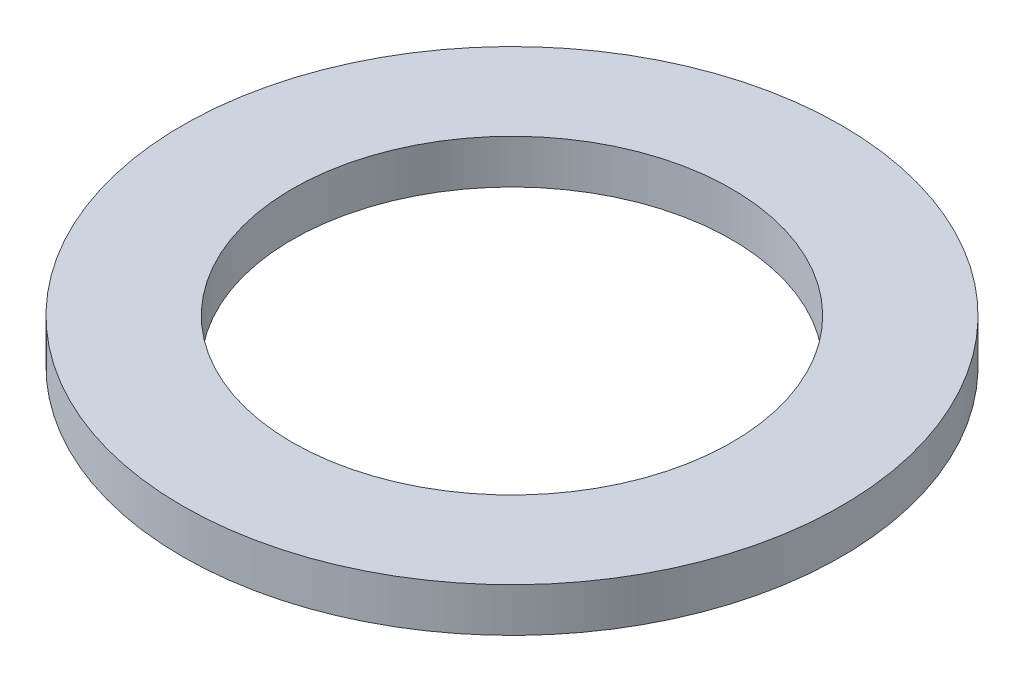
ISO-10303-21;
HEADER;
FILE_DESCRIPTION(('STEP AP214'),'2;1');
FILE_NAME('part.step','',(''),(''),'','','');
FILE_SCHEMA(('AUTOMOTIVE_DESIGN { 1 0 10303 214 1 1 1 1 }'));
ENDSEC;
DATA;
#1=APPLICATION_CONTEXT('core data for automotive mechanical design processes');
#2=APPLICATION_PROTOCOL_DEFINITION('international standard','automotive_design',2000,#1);
#3=PRODUCT_CONTEXT('',#1,'mechanical');
#4=PRODUCT('Part','Part','',(#3));
#5=PRODUCT_RELATED_PRODUCT_CATEGORY('part','',(#4));
#6=PRODUCT_DEFINITION_FORMATION('','',#4);
#7=PRODUCT_DEFINITION_CONTEXT('part definition',#1,'design');
#8=PRODUCT_DEFINITION('design','',#6,#7);
#9=PRODUCT_DEFINITION_SHAPE('','',#8);
#10=(LENGTH_UNIT() NAMED_UNIT(*) SI_UNIT(.MILLI.,.METRE.));
#11=(NAMED_UNIT(*) PLANE_ANGLE_UNIT() SI_UNIT($,.RADIAN.));
#12=(NAMED_UNIT(*) SI_UNIT($,.STERADIAN.) SOLID_ANGLE_UNIT());
#13=UNCERTAINTY_MEASURE_WITH_UNIT(LENGTH_MEASURE(1.E-05),#10,'distance_accuracy_value','');
#14=(GEOMETRIC_REPRESENTATION_CONTEXT(3) GLOBAL_UNCERTAINTY_ASSIGNED_CONTEXT((#13)) GLOBAL_UNIT_ASSIGNED_CONTEXT((#10,
#11,#12)) REPRESENTATION_CONTEXT('',''));
#15=CARTESIAN_POINT('',(0.,0.,0.));
#16=DIRECTION('',(0.,0.,1.));
#17=DIRECTION('',(1.,0.,0.));
#18=AXIS2_PLACEMENT_3D('',#15,#16,#17);
#19=CARTESIAN_POINT('',(0.,1.,0.));
#20=DIRECTION('',(0.,1.,0.));
#21=DIRECTION('',(0.,0.,1.));
#22=AXIS2_PLACEMENT_3D('',#19,#20,#21);
#23=PLANE('',#22);
#24=CARTESIAN_POINT('',(0.,1.,0.));
#25=DIRECTION('',(0.,1.,0.));
#26=DIRECTION('',(0.,0.,1.));
#27=AXIS2_PLACEMENT_3D('',#24,#25,#26);
#28=CIRCLE('',#27,7.5);
#29=CARTESIAN_POINT('',(0.,1.,7.5));
#30=VERTEX_POINT('',#29);
#31=EDGE_CURVE('E10',#30,#30,#28,.T.);
#32=ORIENTED_EDGE('',*,*,#31,.T.);
#33=EDGE_LOOP('',(#32));
#34=FACE_BOUND('',#33,.T.);
#35=CARTESIAN_POINT('',(0.,1.,0.));
#36=DIRECTION('',(0.,1.,0.));
#37=DIRECTION('',(0.,0.,1.));
#38=AXIS2_PLACEMENT_3D('',#35,#36,#37);
#39=CIRCLE('',#38,5.);
#40=CARTESIAN_POINT('',(0.,1.,5.));
#41=VERTEX_POINT('',#40);
#42=EDGE_CURVE('E50',#41,#41,#39,.T.);
#43=ORIENTED_EDGE('',*,*,#42,.F.);
#44=EDGE_LOOP('',(#43));
#45=FACE_BOUND('',#44,.T.);
#46=ADVANCED_FACE('F37',(#34,#45),#23,.T.);
#47=CARTESIAN_POINT('',(0.,0.,0.));
#48=DIRECTION('',(0.,1.,0.));
#49=DIRECTION('',(0.,0.,1.));
#50=AXIS2_PLACEMENT_3D('',#47,#48,#49);
#51=PLANE('',#50);
#52=CARTESIAN_POINT('',(0.,0.,0.));
#53=DIRECTION('',(0.,1.,0.));
#54=DIRECTION('',(0.,0.,1.));
#55=AXIS2_PLACEMENT_3D('',#52,#53,#54);
#56=CIRCLE('',#55,7.5);
#57=CARTESIAN_POINT('',(0.,0.,7.5));
#58=VERTEX_POINT('',#57);
#59=EDGE_CURVE('E41',#58,#58,#56,.T.);
#60=ORIENTED_EDGE('',*,*,#59,.F.);
#61=EDGE_LOOP('',(#60));
#62=FACE_BOUND('',#61,.T.);
#63=CARTESIAN_POINT('',(0.,0.,0.));
#64=DIRECTION('',(0.,1.,0.));
#65=DIRECTION('',(0.,0.,1.));
#66=AXIS2_PLACEMENT_3D('',#63,#64,#65);
#67=CIRCLE('',#66,5.);
#68=CARTESIAN_POINT('',(0.,0.,5.));
#69=VERTEX_POINT('',#68);
#70=EDGE_CURVE('E52',#69,#69,#67,.T.);
#71=ORIENTED_EDGE('',*,*,#70,.T.);
#72=EDGE_LOOP('',(#71));
#73=FACE_BOUND('',#72,.T.);
#74=ADVANCED_FACE('F64',(#62,#73),#51,.F.);
#75=CARTESIAN_POINT('',(0.,1.,0.));
#76=DIRECTION('',(0.,-1.,0.));
#77=DIRECTION('',(0.,0.,-1.));
#78=AXIS2_PLACEMENT_3D('',#75,#76,#77);
#79=CYLINDRICAL_SURFACE('',#78,7.5);
#80=ORIENTED_EDGE('',*,*,#31,.F.);
#81=EDGE_LOOP('',(#80));
#82=FACE_BOUND('',#81,.T.);
#83=ORIENTED_EDGE('',*,*,#59,.T.);
#84=EDGE_LOOP('',(#83));
#85=FACE_BOUND('',#84,.T.);
#86=ADVANCED_FACE('F39',(#82,#85),#79,.T.);
#87=CARTESIAN_POINT('',(0.,1.,0.));
#88=DIRECTION('',(0.,-1.,0.));
#89=DIRECTION('',(0.,0.,-1.));
#90=AXIS2_PLACEMENT_3D('',#87,#88,#89);
#91=CYLINDRICAL_SURFACE('',#90,5.);
#92=ORIENTED_EDGE('',*,*,#42,.T.);
#93=EDGE_LOOP('',(#92));
#94=FACE_BOUND('',#93,.T.);
#95=ORIENTED_EDGE('',*,*,#70,.F.);
#96=EDGE_LOOP('',(#95));
#97=FACE_BOUND('',#96,.T.);
#98=ADVANCED_FACE('F60',(#94,#97),#91,.F.);
#99=CLOSED_SHELL('',(#46,#74,#86,#98));
#100=MANIFOLD_SOLID_BREP('B2',#99);
#101=ADVANCED_BREP_SHAPE_REPRESENTATION('',(#18,#100),#14);
#102=SHAPE_DEFINITION_REPRESENTATION(#9,#101);
ENDSEC;
END-ISO-10303-21;
